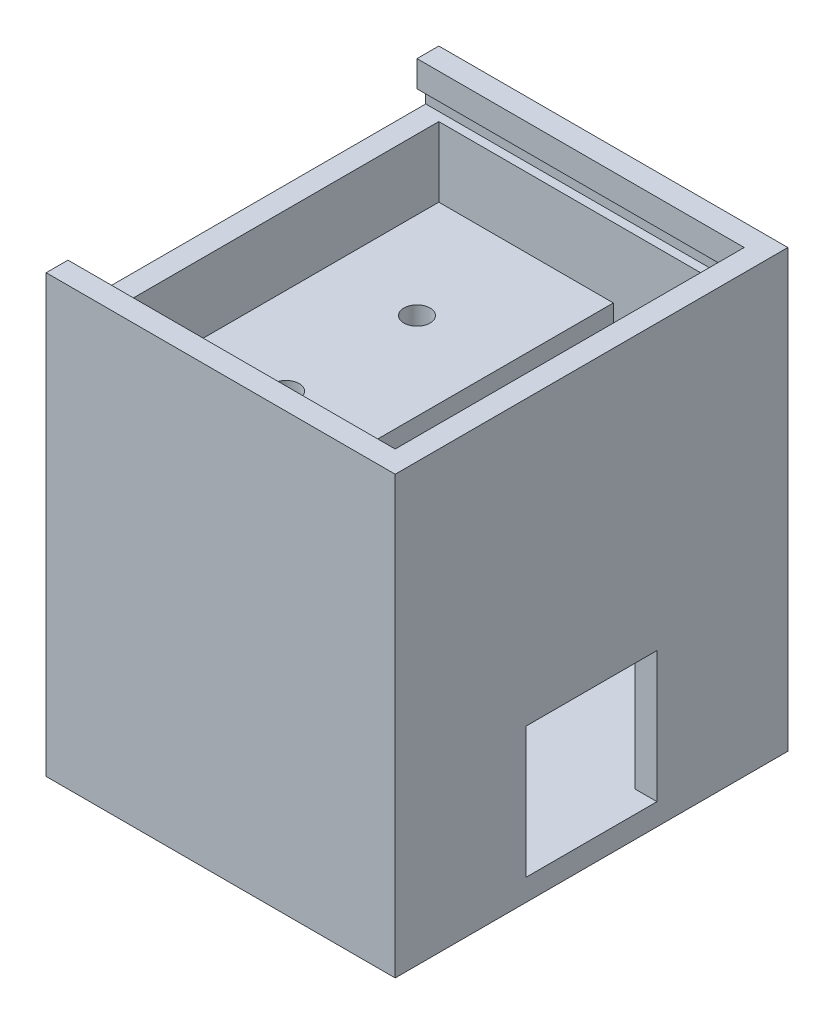
ISO-10303-21;
HEADER;
FILE_DESCRIPTION(('STEP AP214'),'2;1');
FILE_NAME('part.step','',(''),(''),'','','');
FILE_SCHEMA(('AUTOMOTIVE_DESIGN { 1 0 10303 214 1 1 1 1 }'));
ENDSEC;
DATA;
#1=APPLICATION_CONTEXT('core data for automotive mechanical design processes');
#2=APPLICATION_PROTOCOL_DEFINITION('international standard','automotive_design',2000,#1);
#3=PRODUCT_CONTEXT('',#1,'mechanical');
#4=PRODUCT('Part','Part','',(#3));
#5=PRODUCT_RELATED_PRODUCT_CATEGORY('part','',(#4));
#6=PRODUCT_DEFINITION_FORMATION('','',#4);
#7=PRODUCT_DEFINITION_CONTEXT('part definition',#1,'design');
#8=PRODUCT_DEFINITION('design','',#6,#7);
#9=PRODUCT_DEFINITION_SHAPE('','',#8);
#10=(LENGTH_UNIT() NAMED_UNIT(*) SI_UNIT(.MILLI.,.METRE.));
#11=(NAMED_UNIT(*) PLANE_ANGLE_UNIT() SI_UNIT($,.RADIAN.));
#12=(NAMED_UNIT(*) SI_UNIT($,.STERADIAN.) SOLID_ANGLE_UNIT());
#13=UNCERTAINTY_MEASURE_WITH_UNIT(LENGTH_MEASURE(1.E-05),#10,'distance_accuracy_value','');
#14=(GEOMETRIC_REPRESENTATION_CONTEXT(3) GLOBAL_UNCERTAINTY_ASSIGNED_CONTEXT((#13)) GLOBAL_UNIT_ASSIGNED_CONTEXT((#10,
#11,#12)) REPRESENTATION_CONTEXT('',''));
#15=CARTESIAN_POINT('',(0.,0.,0.));
#16=DIRECTION('',(0.,0.,1.));
#17=DIRECTION('',(1.,0.,0.));
#18=AXIS2_PLACEMENT_3D('',#15,#16,#17);
#19=CARTESIAN_POINT('',(-22.3887004628611,0.,15.9496536364091));
#20=DIRECTION('',(0.,1.,0.));
#21=DIRECTION('',(0.,0.,1.));
#22=AXIS2_PLACEMENT_3D('',#19,#20,#21);
#23=CYLINDRICAL_SURFACE('',#22,1.5);
#24=CARTESIAN_POINT('',(-22.3887004628611,37.,15.9496536364091));
#25=DIRECTION('',(0.,1.,0.));
#26=DIRECTION('',(0.,0.,1.));
#27=AXIS2_PLACEMENT_3D('',#24,#25,#26);
#28=CIRCLE('',#27,1.5);
#29=CARTESIAN_POINT('',(-22.3887004628611,37.,17.4496536364091));
#30=VERTEX_POINT('',#29);
#31=EDGE_CURVE('E234',#30,#30,#28,.T.);
#32=ORIENTED_EDGE('',*,*,#31,.T.);
#33=EDGE_LOOP('',(#32));
#34=FACE_BOUND('',#33,.T.);
#35=CARTESIAN_POINT('',(-22.3887004628611,5.,15.9496536364091));
#36=DIRECTION('',(0.,-1.,0.));
#37=DIRECTION('',(0.,0.,-1.));
#38=AXIS2_PLACEMENT_3D('',#35,#36,#37);
#39=CIRCLE('',#38,1.5);
#40=CARTESIAN_POINT('',(-22.3887004628611,5.,14.4496536364091));
#41=VERTEX_POINT('',#40);
#42=EDGE_CURVE('E37',#41,#41,#39,.F.);
#43=ORIENTED_EDGE('',*,*,#42,.F.);
#44=EDGE_LOOP('',(#43));
#45=FACE_BOUND('',#44,.T.);
#46=ADVANCED_FACE('F33',(#34,#45),#23,.F.);
#47=CARTESIAN_POINT('',(-22.3887004628611,0.,0.949653636409059));
#48=DIRECTION('',(0.,1.,0.));
#49=DIRECTION('',(0.,0.,1.));
#50=AXIS2_PLACEMENT_3D('',#47,#48,#49);
#51=CYLINDRICAL_SURFACE('',#50,1.5);
#52=CARTESIAN_POINT('',(-22.3887004628611,37.,0.949653636409066));
#53=DIRECTION('',(0.,1.,0.));
#54=DIRECTION('',(0.,0.,1.));
#55=AXIS2_PLACEMENT_3D('',#52,#53,#54);
#56=CIRCLE('',#55,1.5);
#57=CARTESIAN_POINT('',(-22.3887004628611,37.,2.44965363640907));
#58=VERTEX_POINT('',#57);
#59=EDGE_CURVE('E231',#58,#58,#56,.T.);
#60=ORIENTED_EDGE('',*,*,#59,.T.);
#61=EDGE_LOOP('',(#60));
#62=FACE_BOUND('',#61,.T.);
#63=CARTESIAN_POINT('',(-22.3887004628611,5.,0.94965363640906));
#64=DIRECTION('',(0.,-1.,0.));
#65=DIRECTION('',(0.,0.,-1.));
#66=AXIS2_PLACEMENT_3D('',#63,#64,#65);
#67=CIRCLE('',#66,1.5);
#68=CARTESIAN_POINT('',(-22.3887004628611,5.,-0.550346363590941));
#69=VERTEX_POINT('',#68);
#70=EDGE_CURVE('E222',#69,#69,#67,.F.);
#71=ORIENTED_EDGE('',*,*,#70,.F.);
#72=EDGE_LOOP('',(#71));
#73=FACE_BOUND('',#72,.T.);
#74=ADVANCED_FACE('F379',(#62,#73),#51,.F.);
#75=CARTESIAN_POINT('',(-34.8887004628611,50.,28.4496536364091));
#76=DIRECTION('',(0.,0.,-1.));
#77=DIRECTION('',(-1.,0.,0.));
#78=AXIS2_PLACEMENT_3D('',#75,#76,#77);
#79=PLANE('',#78);
#80=DIRECTION('',(-1.,0.,0.));
#81=VECTOR('',#80,1.);
#82=CARTESIAN_POINT('',(-34.8887004628611,45.,28.4496536364091));
#83=LINE('',#82,#81);
#84=CARTESIAN_POINT('',(2.61129953713887,45.,28.4496536364091));
#85=VERTEX_POINT('',#84);
#86=CARTESIAN_POINT('',(-32.3887004628611,45.,28.4496536364091));
#87=VERTEX_POINT('',#86);
#88=EDGE_CURVE('E242',#85,#87,#83,.T.);
#89=ORIENTED_EDGE('',*,*,#88,.F.);
#90=DIRECTION('',(0.,-1.,0.));
#91=VECTOR('',#90,1.);
#92=CARTESIAN_POINT('',(2.61129953713887,50.,28.4496536364091));
#93=LINE('',#92,#91);
#94=CARTESIAN_POINT('',(2.61129953713887,2.5,28.4496536364091));
#95=VERTEX_POINT('',#94);
#96=EDGE_CURVE('E329',#85,#95,#93,.T.);
#97=ORIENTED_EDGE('',*,*,#96,.T.);
#98=DIRECTION('',(1.,0.,0.));
#99=VECTOR('',#98,1.);
#100=CARTESIAN_POINT('',(-34.8887004628611,2.5,28.4496536364091));
#101=LINE('',#100,#99);
#102=CARTESIAN_POINT('',(-12.3887004628611,2.5,28.4496536364091));
#103=VERTEX_POINT('',#102);
#104=EDGE_CURVE('E315',#103,#95,#101,.T.);
#105=ORIENTED_EDGE('',*,*,#104,.F.);
#106=DIRECTION('',(0.,-1.,0.));
#107=VECTOR('',#106,1.);
#108=CARTESIAN_POINT('',(-12.3887004628611,2.49999999999999,28.4496536364091));
#109=LINE('',#108,#107);
#110=CARTESIAN_POINT('',(-12.3887004628611,37.,28.4496536364091));
#111=VERTEX_POINT('',#110);
#112=EDGE_CURVE('E301',#111,#103,#109,.T.);
#113=ORIENTED_EDGE('',*,*,#112,.F.);
#114=DIRECTION('',(-1.,0.,0.));
#115=VECTOR('',#114,1.);
#116=CARTESIAN_POINT('',(-12.3887004628611,37.,28.4496536364091));
#117=LINE('',#116,#115);
#118=CARTESIAN_POINT('',(-32.3887004628611,37.,28.4496536364091));
#119=VERTEX_POINT('',#118);
#120=EDGE_CURVE('E307',#111,#119,#117,.T.);
#121=ORIENTED_EDGE('',*,*,#120,.T.);
#122=DIRECTION('',(0.,-1.,0.));
#123=VECTOR('',#122,1.);
#124=CARTESIAN_POINT('',(-32.3887004628611,50.,28.4496536364091));
#125=LINE('',#124,#123);
#126=EDGE_CURVE('E316',#87,#119,#125,.T.);
#127=ORIENTED_EDGE('',*,*,#126,.F.);
#128=EDGE_LOOP('',(#89,#97,#105,#113,#121,#127));
#129=FACE_BOUND('',#128,.T.);
#130=ADVANCED_FACE('F385',(#129),#79,.T.);
#131=CARTESIAN_POINT('',(-34.8887004628611,50.,-11.5503463635909));
#132=DIRECTION('',(0.,0.,1.));
#133=DIRECTION('',(1.,0.,0.));
#134=AXIS2_PLACEMENT_3D('',#131,#132,#133);
#135=PLANE('',#134);
#136=DIRECTION('',(-1.,0.,0.));
#137=VECTOR('',#136,1.);
#138=CARTESIAN_POINT('',(-34.8887004628611,47.,-11.5503463635909));
#139=LINE('',#138,#137);
#140=CARTESIAN_POINT('',(2.61129953713886,47.,-11.5503463635909));
#141=VERTEX_POINT('',#140);
#142=CARTESIAN_POINT('',(-34.8887004628611,47.,-11.5503463635909));
#143=VERTEX_POINT('',#142);
#144=EDGE_CURVE('E265',#141,#143,#139,.T.);
#145=ORIENTED_EDGE('',*,*,#144,.F.);
#146=DIRECTION('',(0.,-1.,0.));
#147=VECTOR('',#146,1.);
#148=CARTESIAN_POINT('',(2.61129953713887,50.,-11.5503463635909));
#149=LINE('',#148,#147);
#150=CARTESIAN_POINT('',(2.61129953713886,50.,-11.5503463635909));
#151=VERTEX_POINT('',#150);
#152=EDGE_CURVE('E334',#151,#141,#149,.T.);
#153=ORIENTED_EDGE('',*,*,#152,.F.);
#154=DIRECTION('',(-1.,0.,0.));
#155=VECTOR('',#154,1.);
#156=CARTESIAN_POINT('',(-34.8887004628611,50.,-11.5503463635909));
#157=LINE('',#156,#155);
#158=CARTESIAN_POINT('',(-34.8887004628611,50.,-11.5503463635909));
#159=VERTEX_POINT('',#158);
#160=EDGE_CURVE('E323',#151,#159,#157,.T.);
#161=ORIENTED_EDGE('',*,*,#160,.T.);
#162=DIRECTION('',(0.,1.,0.));
#163=VECTOR('',#162,1.);
#164=CARTESIAN_POINT('',(-34.8887004628611,50.,-11.5503463635909));
#165=LINE('',#164,#163);
#166=EDGE_CURVE('E285',#143,#159,#165,.T.);
#167=ORIENTED_EDGE('',*,*,#166,.F.);
#168=EDGE_LOOP('',(#145,#153,#161,#167));
#169=FACE_BOUND('',#168,.T.);
#170=ADVANCED_FACE('F424',(#169),#135,.T.);
#171=CARTESIAN_POINT('',(-32.3887004628611,50.,-14.0503463635909));
#172=DIRECTION('',(1.,0.,0.));
#173=DIRECTION('',(0.,0.,-1.));
#174=AXIS2_PLACEMENT_3D('',#171,#172,#173);
#175=PLANE('',#174);
#176=DIRECTION('',(0.,0.,-1.));
#177=VECTOR('',#176,1.);
#178=CARTESIAN_POINT('',(-32.3887004628611,45.,-11.5503463635909));
#179=LINE('',#178,#177);
#180=CARTESIAN_POINT('',(-32.3887004628611,45.,-11.5503463635909));
#181=VERTEX_POINT('',#180);
#182=EDGE_CURVE('E280',#87,#181,#179,.T.);
#183=ORIENTED_EDGE('',*,*,#182,.F.);
#184=ORIENTED_EDGE('',*,*,#126,.T.);
#185=DIRECTION('',(0.,0.,1.));
#186=VECTOR('',#185,1.);
#187=CARTESIAN_POINT('',(-32.3887004628611,37.,-11.5503463635909));
#188=LINE('',#187,#186);
#189=CARTESIAN_POINT('',(-32.3887004628611,37.,-11.5503463635909));
#190=VERTEX_POINT('',#189);
#191=EDGE_CURVE('E292',#190,#119,#188,.T.);
#192=ORIENTED_EDGE('',*,*,#191,.F.);
#193=DIRECTION('',(0.,-1.,0.));
#194=VECTOR('',#193,1.);
#195=CARTESIAN_POINT('',(-32.3887004628611,50.,-11.5503463635909));
#196=LINE('',#195,#194);
#197=EDGE_CURVE('E320',#181,#190,#196,.T.);
#198=ORIENTED_EDGE('',*,*,#197,.F.);
#199=EDGE_LOOP('',(#183,#184,#192,#198));
#200=FACE_BOUND('',#199,.T.);
#201=ADVANCED_FACE('F420',(#200),#175,.T.);
#202=DIRECTION('',(1.,0.,0.));
#203=VECTOR('',#202,1.);
#204=CARTESIAN_POINT('',(-34.8887004628611,47.,28.4496536364091));
#205=LINE('',#204,#203);
#206=CARTESIAN_POINT('',(-34.8887004628611,47.,28.4496536364091));
#207=VERTEX_POINT('',#206);
#208=CARTESIAN_POINT('',(2.61129953713887,47.,28.4496536364091));
#209=VERTEX_POINT('',#208);
#210=EDGE_CURVE('E237',#207,#209,#205,.T.);
#211=ORIENTED_EDGE('',*,*,#210,.F.);
#212=DIRECTION('',(0.,-1.,0.));
#213=VECTOR('',#212,1.);
#214=CARTESIAN_POINT('',(-34.8887004628611,50.,28.4496536364091));
#215=LINE('',#214,#213);
#216=CARTESIAN_POINT('',(-34.8887004628611,50.,28.4496536364091));
#217=VERTEX_POINT('',#216);
#218=EDGE_CURVE('E287',#217,#207,#215,.T.);
#219=ORIENTED_EDGE('',*,*,#218,.F.);
#220=DIRECTION('',(1.,0.,0.));
#221=VECTOR('',#220,1.);
#222=CARTESIAN_POINT('',(-34.8887004628611,50.,28.4496536364091));
#223=LINE('',#222,#221);
#224=CARTESIAN_POINT('',(2.61129953713887,50.,28.4496536364091));
#225=VERTEX_POINT('',#224);
#226=EDGE_CURVE('E338',#217,#225,#223,.T.);
#227=ORIENTED_EDGE('',*,*,#226,.T.);
#228=EDGE_CURVE('E319',#225,#209,#93,.T.);
#229=ORIENTED_EDGE('',*,*,#228,.T.);
#230=EDGE_LOOP('',(#211,#219,#227,#229));
#231=FACE_BOUND('',#230,.T.);
#232=ADVANCED_FACE('F423',(#231),#79,.T.);
#233=DIRECTION('',(1.,0.,0.));
#234=VECTOR('',#233,1.);
#235=CARTESIAN_POINT('',(-34.8887004628611,45.,-11.5503463635909));
#236=LINE('',#235,#234);
#237=CARTESIAN_POINT('',(2.61129953713887,45.,-11.5503463635909));
#238=VERTEX_POINT('',#237);
#239=EDGE_CURVE('E257',#181,#238,#236,.T.);
#240=ORIENTED_EDGE('',*,*,#239,.F.);
#241=ORIENTED_EDGE('',*,*,#197,.T.);
#242=DIRECTION('',(-1.,0.,0.));
#243=VECTOR('',#242,1.);
#244=CARTESIAN_POINT('',(-12.3887004628611,37.,-11.5503463635909));
#245=LINE('',#244,#243);
#246=CARTESIAN_POINT('',(-12.3887004628611,37.,-11.5503463635909));
#247=VERTEX_POINT('',#246);
#248=EDGE_CURVE('E312',#247,#190,#245,.T.);
#249=ORIENTED_EDGE('',*,*,#248,.F.);
#250=DIRECTION('',(0.,1.,0.));
#251=VECTOR('',#250,1.);
#252=CARTESIAN_POINT('',(-12.3887004628611,2.5,-11.5503463635909));
#253=LINE('',#252,#251);
#254=CARTESIAN_POINT('',(-12.3887004628611,2.5,-11.5503463635909));
#255=VERTEX_POINT('',#254);
#256=EDGE_CURVE('E295',#255,#247,#253,.T.);
#257=ORIENTED_EDGE('',*,*,#256,.F.);
#258=DIRECTION('',(-1.,0.,0.));
#259=VECTOR('',#258,1.);
#260=CARTESIAN_POINT('',(-34.8887004628611,2.5,-11.5503463635909));
#261=LINE('',#260,#259);
#262=CARTESIAN_POINT('',(2.61129953713886,2.5,-11.5503463635909));
#263=VERTEX_POINT('',#262);
#264=EDGE_CURVE('E333',#263,#255,#261,.T.);
#265=ORIENTED_EDGE('',*,*,#264,.F.);
#266=EDGE_CURVE('E322',#238,#263,#149,.T.);
#267=ORIENTED_EDGE('',*,*,#266,.F.);
#268=EDGE_LOOP('',(#240,#241,#249,#257,#265,#267));
#269=FACE_BOUND('',#268,.T.);
#270=ADVANCED_FACE('F428',(#269),#135,.T.);
#271=CARTESIAN_POINT('',(-34.8887004628611,50.,-14.0503463635909));
#272=DIRECTION('',(1.,0.,0.));
#273=DIRECTION('',(0.,0.,-1.));
#274=AXIS2_PLACEMENT_3D('',#271,#272,#273);
#275=PLANE('',#274);
#276=DIRECTION('',(0.,1.,0.));
#277=VECTOR('',#276,1.);
#278=CARTESIAN_POINT('',(-34.8887004628611,45.,29.4496536364091));
#279=LINE('',#278,#277);
#280=CARTESIAN_POINT('',(-34.8887004628611,45.,29.4496536364091));
#281=VERTEX_POINT('',#280);
#282=CARTESIAN_POINT('',(-34.8887004628611,47.,29.4496536364091));
#283=VERTEX_POINT('',#282);
#284=EDGE_CURVE('E238',#281,#283,#279,.T.);
#285=ORIENTED_EDGE('',*,*,#284,.F.);
#286=DIRECTION('',(0.,0.,-1.));
#287=VECTOR('',#286,1.);
#288=CARTESIAN_POINT('',(-34.8887004628611,45.,-11.5503463635909));
#289=LINE('',#288,#287);
#290=CARTESIAN_POINT('',(-34.8887004628611,45.,-12.5503463635909));
#291=VERTEX_POINT('',#290);
#292=EDGE_CURVE('E290',#281,#291,#289,.T.);
#293=ORIENTED_EDGE('',*,*,#292,.T.);
#294=DIRECTION('',(0.,-1.,0.));
#295=VECTOR('',#294,1.);
#296=CARTESIAN_POINT('',(-34.8887004628611,45.,-12.5503463635909));
#297=LINE('',#296,#295);
#298=CARTESIAN_POINT('',(-34.8887004628611,47.,-12.5503463635909));
#299=VERTEX_POINT('',#298);
#300=EDGE_CURVE('E261',#299,#291,#297,.T.);
#301=ORIENTED_EDGE('',*,*,#300,.F.);
#302=DIRECTION('',(0.,0.,1.));
#303=VECTOR('',#302,1.);
#304=CARTESIAN_POINT('',(-34.8887004628611,47.,-12.5503463635909));
#305=LINE('',#304,#303);
#306=EDGE_CURVE('E277',#299,#143,#305,.T.);
#307=ORIENTED_EDGE('',*,*,#306,.T.);
#308=ORIENTED_EDGE('',*,*,#166,.T.);
#309=DIRECTION('',(0.,0.,1.));
#310=VECTOR('',#309,1.);
#311=CARTESIAN_POINT('',(-34.8887004628611,50.,-14.0503463635909));
#312=LINE('',#311,#310);
#313=CARTESIAN_POINT('',(-34.8887004628611,50.,-14.0503463635909));
#314=VERTEX_POINT('',#313);
#315=EDGE_CURVE('E345',#314,#159,#312,.T.);
#316=ORIENTED_EDGE('',*,*,#315,.F.);
#317=DIRECTION('',(0.,-1.,0.));
#318=VECTOR('',#317,1.);
#319=CARTESIAN_POINT('',(-34.8887004628611,50.,-14.0503463635909));
#320=LINE('',#319,#318);
#321=CARTESIAN_POINT('',(-34.8887004628611,0.,-14.0503463635909));
#322=VERTEX_POINT('',#321);
#323=EDGE_CURVE('E355',#314,#322,#320,.T.);
#324=ORIENTED_EDGE('',*,*,#323,.T.);
#325=DIRECTION('',(0.,0.,1.));
#326=VECTOR('',#325,1.);
#327=CARTESIAN_POINT('',(-34.8887004628611,0.,-14.0503463635909));
#328=LINE('',#327,#326);
#329=CARTESIAN_POINT('',(-34.8887004628611,0.,30.9496536364091));
#330=VERTEX_POINT('',#329);
#331=EDGE_CURVE('E318',#322,#330,#328,.T.);
#332=ORIENTED_EDGE('',*,*,#331,.T.);
#333=DIRECTION('',(0.,-1.,0.));
#334=VECTOR('',#333,1.);
#335=CARTESIAN_POINT('',(-34.8887004628611,50.,30.9496536364091));
#336=LINE('',#335,#334);
#337=CARTESIAN_POINT('',(-34.8887004628611,50.,30.9496536364091));
#338=VERTEX_POINT('',#337);
#339=EDGE_CURVE('E11',#338,#330,#336,.T.);
#340=ORIENTED_EDGE('',*,*,#339,.F.);
#341=EDGE_CURVE('E349',#217,#338,#312,.T.);
#342=ORIENTED_EDGE('',*,*,#341,.F.);
#343=ORIENTED_EDGE('',*,*,#218,.T.);
#344=DIRECTION('',(0.,0.,-1.));
#345=VECTOR('',#344,1.);
#346=CARTESIAN_POINT('',(-34.8887004628611,47.,29.4496536364091));
#347=LINE('',#346,#345);
#348=EDGE_CURVE('E251',#283,#207,#347,.T.);
#349=ORIENTED_EDGE('',*,*,#348,.F.);
#350=EDGE_LOOP('',(#285,#293,#301,#307,#308,#316,#324,#332,#340,#342,#343,#349));
#351=FACE_BOUND('',#350,.T.);
#352=ADVANCED_FACE('F35',(#351),#275,.F.);
#353=CARTESIAN_POINT('',(-34.8887004628611,50.,30.9496536364091));
#354=DIRECTION('',(0.,0.,-1.));
#355=DIRECTION('',(-1.,0.,0.));
#356=AXIS2_PLACEMENT_3D('',#353,#354,#355);
#357=PLANE('',#356);
#358=DIRECTION('',(1.,0.,0.));
#359=VECTOR('',#358,1.);
#360=CARTESIAN_POINT('',(-34.8887004628611,0.,30.9496536364091));
#361=LINE('',#360,#359);
#362=CARTESIAN_POINT('',(5.11129953713887,0.,30.9496536364091));
#363=VERTEX_POINT('',#362);
#364=EDGE_CURVE('E358',#330,#363,#361,.T.);
#365=ORIENTED_EDGE('',*,*,#364,.T.);
#366=DIRECTION('',(0.,-1.,0.));
#367=VECTOR('',#366,1.);
#368=CARTESIAN_POINT('',(5.11129953713887,50.,30.9496536364091));
#369=LINE('',#368,#367);
#370=CARTESIAN_POINT('',(5.11129953713887,50.,30.9496536364091));
#371=VERTEX_POINT('',#370);
#372=EDGE_CURVE('E42',#371,#363,#369,.T.);
#373=ORIENTED_EDGE('',*,*,#372,.F.);
#374=DIRECTION('',(1.,0.,0.));
#375=VECTOR('',#374,1.);
#376=CARTESIAN_POINT('',(-34.8887004628611,50.,30.9496536364091));
#377=LINE('',#376,#375);
#378=EDGE_CURVE('E348',#338,#371,#377,.T.);
#379=ORIENTED_EDGE('',*,*,#378,.F.);
#380=ORIENTED_EDGE('',*,*,#339,.T.);
#381=EDGE_LOOP('',(#365,#373,#379,#380));
#382=FACE_BOUND('',#381,.T.);
#383=ADVANCED_FACE('F453',(#382),#357,.F.);
#384=CARTESIAN_POINT('',(5.11129953713886,50.,-14.0503463635909));
#385=DIRECTION('',(-1.,0.,0.));
#386=DIRECTION('',(0.,0.,1.));
#387=AXIS2_PLACEMENT_3D('',#384,#385,#386);
#388=PLANE('',#387);
#389=DIRECTION('',(0.,0.,1.));
#390=VECTOR('',#389,1.);
#391=CARTESIAN_POINT('',(5.11129953713887,2.5,15.9496536364091));
#392=LINE('',#391,#390);
#393=CARTESIAN_POINT('',(5.11129953713886,2.5,0.949653636409072));
#394=VERTEX_POINT('',#393);
#395=CARTESIAN_POINT('',(5.11129953713887,2.5,15.9496536364091));
#396=VERTEX_POINT('',#395);
#397=EDGE_CURVE('E195',#394,#396,#392,.T.);
#398=ORIENTED_EDGE('',*,*,#397,.T.);
#399=DIRECTION('',(0.,1.,0.));
#400=VECTOR('',#399,1.);
#401=CARTESIAN_POINT('',(5.11129953713887,2.5,15.9496536364091));
#402=LINE('',#401,#400);
#403=CARTESIAN_POINT('',(5.11129953713887,17.5,15.9496536364091));
#404=VERTEX_POINT('',#403);
#405=EDGE_CURVE('E187',#396,#404,#402,.T.);
#406=ORIENTED_EDGE('',*,*,#405,.T.);
#407=DIRECTION('',(0.,0.,-1.));
#408=VECTOR('',#407,1.);
#409=CARTESIAN_POINT('',(5.11129953713887,17.5,15.9496536364091));
#410=LINE('',#409,#408);
#411=CARTESIAN_POINT('',(5.11129953713886,17.5,0.949653636409071));
#412=VERTEX_POINT('',#411);
#413=EDGE_CURVE('E198',#404,#412,#410,.T.);
#414=ORIENTED_EDGE('',*,*,#413,.T.);
#415=DIRECTION('',(0.,-1.,0.));
#416=VECTOR('',#415,1.);
#417=CARTESIAN_POINT('',(5.11129953713886,2.5,0.949653636409072));
#418=LINE('',#417,#416);
#419=EDGE_CURVE('E50',#412,#394,#418,.T.);
#420=ORIENTED_EDGE('',*,*,#419,.T.);
#421=EDGE_LOOP('',(#398,#406,#414,#420));
#422=FACE_BOUND('',#421,.T.);
#423=DIRECTION('',(0.,0.,-1.));
#424=VECTOR('',#423,1.);
#425=CARTESIAN_POINT('',(5.11129953713886,0.,-14.0503463635909));
#426=LINE('',#425,#424);
#427=CARTESIAN_POINT('',(5.11129953713886,0.,-14.0503463635909));
#428=VERTEX_POINT('',#427);
#429=EDGE_CURVE('E360',#363,#428,#426,.T.);
#430=ORIENTED_EDGE('',*,*,#429,.T.);
#431=DIRECTION('',(0.,-1.,0.));
#432=VECTOR('',#431,1.);
#433=CARTESIAN_POINT('',(5.11129953713886,50.,-14.0503463635909));
#434=LINE('',#433,#432);
#435=CARTESIAN_POINT('',(5.11129953713886,50.,-14.0503463635909));
#436=VERTEX_POINT('',#435);
#437=EDGE_CURVE('E366',#436,#428,#434,.T.);
#438=ORIENTED_EDGE('',*,*,#437,.F.);
#439=DIRECTION('',(0.,0.,-1.));
#440=VECTOR('',#439,1.);
#441=CARTESIAN_POINT('',(5.11129953713886,50.,-14.0503463635909));
#442=LINE('',#441,#440);
#443=EDGE_CURVE('E351',#371,#436,#442,.T.);
#444=ORIENTED_EDGE('',*,*,#443,.F.);
#445=ORIENTED_EDGE('',*,*,#372,.T.);
#446=EDGE_LOOP('',(#430,#438,#444,#445));
#447=FACE_BOUND('',#446,.T.);
#448=ADVANCED_FACE('F202',(#422,#447),#388,.F.);
#449=CARTESIAN_POINT('',(-34.8887004628611,50.,-14.0503463635909));
#450=DIRECTION('',(0.,0.,1.));
#451=DIRECTION('',(1.,0.,0.));
#452=AXIS2_PLACEMENT_3D('',#449,#450,#451);
#453=PLANE('',#452);
#454=DIRECTION('',(-1.,0.,0.));
#455=VECTOR('',#454,1.);
#456=CARTESIAN_POINT('',(-34.8887004628611,0.,-14.0503463635909));
#457=LINE('',#456,#455);
#458=EDGE_CURVE('E362',#428,#322,#457,.T.);
#459=ORIENTED_EDGE('',*,*,#458,.T.);
#460=ORIENTED_EDGE('',*,*,#323,.F.);
#461=DIRECTION('',(-1.,0.,0.));
#462=VECTOR('',#461,1.);
#463=CARTESIAN_POINT('',(-34.8887004628611,50.,-14.0503463635909));
#464=LINE('',#463,#462);
#465=EDGE_CURVE('E353',#436,#314,#464,.T.);
#466=ORIENTED_EDGE('',*,*,#465,.F.);
#467=ORIENTED_EDGE('',*,*,#437,.T.);
#468=EDGE_LOOP('',(#459,#460,#466,#467));
#469=FACE_BOUND('',#468,.T.);
#470=ADVANCED_FACE('F444',(#469),#453,.F.);
#471=CARTESIAN_POINT('',(0.,50.,0.));
#472=DIRECTION('',(0.,1.,0.));
#473=DIRECTION('',(0.,0.,1.));
#474=AXIS2_PLACEMENT_3D('',#471,#472,#473);
#475=PLANE('',#474);
#476=ORIENTED_EDGE('',*,*,#315,.T.);
#477=ORIENTED_EDGE('',*,*,#160,.F.);
#478=DIRECTION('',(0.,0.,-1.));
#479=VECTOR('',#478,1.);
#480=CARTESIAN_POINT('',(2.61129953713886,50.,-14.0503463635909));
#481=LINE('',#480,#479);
#482=EDGE_CURVE('E340',#225,#151,#481,.T.);
#483=ORIENTED_EDGE('',*,*,#482,.F.);
#484=ORIENTED_EDGE('',*,*,#226,.F.);
#485=ORIENTED_EDGE('',*,*,#341,.T.);
#486=ORIENTED_EDGE('',*,*,#378,.T.);
#487=ORIENTED_EDGE('',*,*,#443,.T.);
#488=ORIENTED_EDGE('',*,*,#465,.T.);
#489=EDGE_LOOP('',(#476,#477,#483,#484,#485,#486,#487,#488));
#490=FACE_BOUND('',#489,.T.);
#491=ADVANCED_FACE('F441',(#490),#475,.T.);
#492=CARTESIAN_POINT('',(0.,0.,0.));
#493=DIRECTION('',(0.,1.,0.));
#494=DIRECTION('',(0.,0.,1.));
#495=AXIS2_PLACEMENT_3D('',#492,#493,#494);
#496=PLANE('',#495);
#497=CARTESIAN_POINT('',(-22.3887004628611,0.,15.9496536364091));
#498=DIRECTION('',(0.,-1.,0.));
#499=DIRECTION('',(0.,0.,-1.));
#500=AXIS2_PLACEMENT_3D('',#497,#498,#499);
#501=CIRCLE('',#500,3.);
#502=CARTESIAN_POINT('',(-22.3887004628611,0.,12.9496536364091));
#503=VERTEX_POINT('',#502);
#504=EDGE_CURVE('E223',#503,#503,#501,.T.);
#505=ORIENTED_EDGE('',*,*,#504,.F.);
#506=EDGE_LOOP('',(#505));
#507=FACE_BOUND('',#506,.T.);
#508=CARTESIAN_POINT('',(-22.3887004628611,0.,0.949653636409059));
#509=DIRECTION('',(0.,-1.,0.));
#510=DIRECTION('',(0.,0.,-1.));
#511=AXIS2_PLACEMENT_3D('',#508,#509,#510);
#512=CIRCLE('',#511,3.);
#513=CARTESIAN_POINT('',(-22.3887004628611,0.,-2.05034636359094));
#514=VERTEX_POINT('',#513);
#515=EDGE_CURVE('E215',#514,#514,#512,.T.);
#516=ORIENTED_EDGE('',*,*,#515,.F.);
#517=EDGE_LOOP('',(#516));
#518=FACE_BOUND('',#517,.T.);
#519=ORIENTED_EDGE('',*,*,#331,.F.);
#520=ORIENTED_EDGE('',*,*,#458,.F.);
#521=ORIENTED_EDGE('',*,*,#429,.F.);
#522=ORIENTED_EDGE('',*,*,#364,.F.);
#523=EDGE_LOOP('',(#519,#520,#521,#522));
#524=FACE_BOUND('',#523,.T.);
#525=ADVANCED_FACE('F433',(#507,#518,#524),#496,.F.);
#526=CARTESIAN_POINT('',(2.61129953713886,50.,-14.0503463635909));
#527=DIRECTION('',(-1.,0.,0.));
#528=DIRECTION('',(0.,0.,1.));
#529=AXIS2_PLACEMENT_3D('',#526,#527,#528);
#530=PLANE('',#529);
#531=DIRECTION('',(0.,1.,0.));
#532=VECTOR('',#531,1.);
#533=CARTESIAN_POINT('',(2.61129953713887,2.5,15.9496536364091));
#534=LINE('',#533,#532);
#535=CARTESIAN_POINT('',(2.61129953713887,2.5,15.9496536364091));
#536=VERTEX_POINT('',#535);
#537=CARTESIAN_POINT('',(2.61129953713887,17.5,15.9496536364091));
#538=VERTEX_POINT('',#537);
#539=EDGE_CURVE('E190',#536,#538,#534,.T.);
#540=ORIENTED_EDGE('',*,*,#539,.F.);
#541=DIRECTION('',(0.,0.,-1.));
#542=VECTOR('',#541,1.);
#543=CARTESIAN_POINT('',(2.61129953713886,2.5,-14.0503463635909));
#544=LINE('',#543,#542);
#545=EDGE_CURVE('E330',#95,#536,#544,.T.);
#546=ORIENTED_EDGE('',*,*,#545,.F.);
#547=ORIENTED_EDGE('',*,*,#96,.F.);
#548=DIRECTION('',(0.,0.,-1.));
#549=VECTOR('',#548,1.);
#550=CARTESIAN_POINT('',(2.61129953713887,45.,29.4496536364091));
#551=LINE('',#550,#549);
#552=CARTESIAN_POINT('',(2.61129953713887,45.,29.4496536364091));
#553=VERTEX_POINT('',#552);
#554=EDGE_CURVE('E255',#553,#85,#551,.T.);
#555=ORIENTED_EDGE('',*,*,#554,.F.);
#556=DIRECTION('',(0.,-1.,0.));
#557=VECTOR('',#556,1.);
#558=CARTESIAN_POINT('',(2.61129953713887,45.,29.4496536364091));
#559=LINE('',#558,#557);
#560=CARTESIAN_POINT('',(2.61129953713887,47.,29.4496536364091));
#561=VERTEX_POINT('',#560);
#562=EDGE_CURVE('E245',#561,#553,#559,.T.);
#563=ORIENTED_EDGE('',*,*,#562,.F.);
#564=DIRECTION('',(0.,0.,-1.));
#565=VECTOR('',#564,1.);
#566=CARTESIAN_POINT('',(2.61129953713887,47.,29.4496536364091));
#567=LINE('',#566,#565);
#568=EDGE_CURVE('E258',#561,#209,#567,.T.);
#569=ORIENTED_EDGE('',*,*,#568,.T.);
#570=ORIENTED_EDGE('',*,*,#228,.F.);
#571=ORIENTED_EDGE('',*,*,#482,.T.);
#572=ORIENTED_EDGE('',*,*,#152,.T.);
#573=DIRECTION('',(0.,0.,1.));
#574=VECTOR('',#573,1.);
#575=CARTESIAN_POINT('',(2.61129953713886,47.,-12.5503463635909));
#576=LINE('',#575,#574);
#577=CARTESIAN_POINT('',(2.61129953713886,47.,-12.5503463635909));
#578=VERTEX_POINT('',#577);
#579=EDGE_CURVE('E281',#578,#141,#576,.T.);
#580=ORIENTED_EDGE('',*,*,#579,.F.);
#581=DIRECTION('',(0.,1.,0.));
#582=VECTOR('',#581,1.);
#583=CARTESIAN_POINT('',(2.61129953713887,45.,-12.5503463635909));
#584=LINE('',#583,#582);
#585=CARTESIAN_POINT('',(2.61129953713887,45.,-12.5503463635909));
#586=VERTEX_POINT('',#585);
#587=EDGE_CURVE('E268',#586,#578,#584,.T.);
#588=ORIENTED_EDGE('',*,*,#587,.F.);
#589=DIRECTION('',(0.,0.,1.));
#590=VECTOR('',#589,1.);
#591=CARTESIAN_POINT('',(2.61129953713887,45.,-12.5503463635909));
#592=LINE('',#591,#590);
#593=EDGE_CURVE('E274',#586,#238,#592,.T.);
#594=ORIENTED_EDGE('',*,*,#593,.T.);
#595=ORIENTED_EDGE('',*,*,#266,.T.);
#596=CARTESIAN_POINT('',(2.61129953713886,2.5,0.949653636409073));
#597=VERTEX_POINT('',#596);
#598=EDGE_CURVE('E326',#597,#263,#544,.T.);
#599=ORIENTED_EDGE('',*,*,#598,.F.);
#600=DIRECTION('',(0.,-1.,0.));
#601=VECTOR('',#600,1.);
#602=CARTESIAN_POINT('',(2.61129953713886,2.5,0.949653636409073));
#603=LINE('',#602,#601);
#604=CARTESIAN_POINT('',(2.61129953713886,17.5,0.949653636409073));
#605=VERTEX_POINT('',#604);
#606=EDGE_CURVE('E55',#605,#597,#603,.T.);
#607=ORIENTED_EDGE('',*,*,#606,.F.);
#608=DIRECTION('',(0.,0.,-1.));
#609=VECTOR('',#608,1.);
#610=CARTESIAN_POINT('',(2.61129953713887,17.5,15.9496536364091));
#611=LINE('',#610,#609);
#612=EDGE_CURVE('E206',#538,#605,#611,.T.);
#613=ORIENTED_EDGE('',*,*,#612,.F.);
#614=EDGE_LOOP('',(#540,#546,#547,#555,#563,#569,#570,#571,#572,#580,#588,#594,#595,#599,#607,#613));
#615=FACE_BOUND('',#614,.T.);
#616=ADVANCED_FACE('F430',(#615),#530,.T.);
#617=CARTESIAN_POINT('',(0.,2.5,0.));
#618=DIRECTION('',(0.,1.,0.));
#619=DIRECTION('',(0.,0.,1.));
#620=AXIS2_PLACEMENT_3D('',#617,#618,#619);
#621=PLANE('',#620);
#622=DIRECTION('',(0.,0.,-1.));
#623=VECTOR('',#622,1.);
#624=CARTESIAN_POINT('',(-12.3887004628611,2.5,-11.5503463635909));
#625=LINE('',#624,#623);
#626=EDGE_CURVE('E304',#103,#255,#625,.T.);
#627=ORIENTED_EDGE('',*,*,#626,.F.);
#628=ORIENTED_EDGE('',*,*,#104,.T.);
#629=ORIENTED_EDGE('',*,*,#545,.T.);
#630=DIRECTION('',(-1.,0.,0.));
#631=VECTOR('',#630,1.);
#632=CARTESIAN_POINT('',(5.11129953713887,2.5,15.9496536364091));
#633=LINE('',#632,#631);
#634=EDGE_CURVE('E213',#396,#536,#633,.T.);
#635=ORIENTED_EDGE('',*,*,#634,.F.);
#636=ORIENTED_EDGE('',*,*,#397,.F.);
#637=DIRECTION('',(-1.,0.,0.));
#638=VECTOR('',#637,1.);
#639=CARTESIAN_POINT('',(5.11129953713886,2.5,0.949653636409072));
#640=LINE('',#639,#638);
#641=EDGE_CURVE('E216',#394,#597,#640,.T.);
#642=ORIENTED_EDGE('',*,*,#641,.T.);
#643=ORIENTED_EDGE('',*,*,#598,.T.);
#644=ORIENTED_EDGE('',*,*,#264,.T.);
#645=EDGE_LOOP('',(#627,#628,#629,#635,#636,#642,#643,#644));
#646=FACE_BOUND('',#645,.T.);
#647=ADVANCED_FACE('F418',(#646),#621,.T.);
#648=CARTESIAN_POINT('',(-12.3887004628611,37.,-11.5503463635909));
#649=DIRECTION('',(0.,-1.,0.));
#650=DIRECTION('',(0.,0.,-1.));
#651=AXIS2_PLACEMENT_3D('',#648,#649,#650);
#652=PLANE('',#651);
#653=ORIENTED_EDGE('',*,*,#59,.F.);
#654=EDGE_LOOP('',(#653));
#655=FACE_BOUND('',#654,.T.);
#656=ORIENTED_EDGE('',*,*,#31,.F.);
#657=EDGE_LOOP('',(#656));
#658=FACE_BOUND('',#657,.T.);
#659=ORIENTED_EDGE('',*,*,#191,.T.);
#660=ORIENTED_EDGE('',*,*,#120,.F.);
#661=DIRECTION('',(0.,0.,1.));
#662=VECTOR('',#661,1.);
#663=CARTESIAN_POINT('',(-12.3887004628611,37.,-11.5503463635909));
#664=LINE('',#663,#662);
#665=EDGE_CURVE('E298',#247,#111,#664,.T.);
#666=ORIENTED_EDGE('',*,*,#665,.F.);
#667=ORIENTED_EDGE('',*,*,#248,.T.);
#668=EDGE_LOOP('',(#659,#660,#666,#667));
#669=FACE_BOUND('',#668,.T.);
#670=ADVANCED_FACE('F414',(#655,#658,#669),#652,.F.);
#671=CARTESIAN_POINT('',(-12.3887004628611,0.,0.));
#672=DIRECTION('',(1.,0.,0.));
#673=DIRECTION('',(0.,0.,-1.));
#674=AXIS2_PLACEMENT_3D('',#671,#672,#673);
#675=PLANE('',#674);
#676=ORIENTED_EDGE('',*,*,#256,.T.);
#677=ORIENTED_EDGE('',*,*,#665,.T.);
#678=ORIENTED_EDGE('',*,*,#112,.T.);
#679=ORIENTED_EDGE('',*,*,#626,.T.);
#680=EDGE_LOOP('',(#676,#677,#678,#679));
#681=FACE_BOUND('',#680,.T.);
#682=ADVANCED_FACE('F410',(#681),#675,.T.);
#683=CARTESIAN_POINT('',(-34.8887004628611,45.,-11.5503463635909));
#684=DIRECTION('',(0.,-1.,0.));
#685=DIRECTION('',(0.,0.,-1.));
#686=AXIS2_PLACEMENT_3D('',#683,#684,#685);
#687=PLANE('',#686);
#688=ORIENTED_EDGE('',*,*,#182,.T.);
#689=ORIENTED_EDGE('',*,*,#239,.T.);
#690=ORIENTED_EDGE('',*,*,#593,.F.);
#691=DIRECTION('',(1.,0.,0.));
#692=VECTOR('',#691,1.);
#693=CARTESIAN_POINT('',(-34.8887004628611,45.,-12.5503463635909));
#694=LINE('',#693,#692);
#695=EDGE_CURVE('E264',#291,#586,#694,.T.);
#696=ORIENTED_EDGE('',*,*,#695,.F.);
#697=ORIENTED_EDGE('',*,*,#292,.F.);
#698=DIRECTION('',(-1.,0.,0.));
#699=VECTOR('',#698,1.);
#700=CARTESIAN_POINT('',(-34.8887004628611,45.,29.4496536364091));
#701=LINE('',#700,#699);
#702=EDGE_CURVE('E248',#553,#281,#701,.T.);
#703=ORIENTED_EDGE('',*,*,#702,.F.);
#704=ORIENTED_EDGE('',*,*,#554,.T.);
#705=ORIENTED_EDGE('',*,*,#88,.T.);
#706=EDGE_LOOP('',(#688,#689,#690,#696,#697,#703,#704,#705));
#707=FACE_BOUND('',#706,.T.);
#708=ADVANCED_FACE('F406',(#707),#687,.F.);
#709=CARTESIAN_POINT('',(-34.8887004628611,47.,-12.5503463635909));
#710=DIRECTION('',(0.,1.,0.));
#711=DIRECTION('',(0.,0.,1.));
#712=AXIS2_PLACEMENT_3D('',#709,#710,#711);
#713=PLANE('',#712);
#714=ORIENTED_EDGE('',*,*,#144,.T.);
#715=ORIENTED_EDGE('',*,*,#306,.F.);
#716=DIRECTION('',(-1.,0.,0.));
#717=VECTOR('',#716,1.);
#718=CARTESIAN_POINT('',(-34.8887004628611,47.,-12.5503463635909));
#719=LINE('',#718,#717);
#720=EDGE_CURVE('E271',#578,#299,#719,.T.);
#721=ORIENTED_EDGE('',*,*,#720,.F.);
#722=ORIENTED_EDGE('',*,*,#579,.T.);
#723=EDGE_LOOP('',(#714,#715,#721,#722));
#724=FACE_BOUND('',#723,.T.);
#725=ADVANCED_FACE('F402',(#724),#713,.F.);
#726=CARTESIAN_POINT('',(0.,0.,-12.5503463635909));
#727=DIRECTION('',(0.,0.,-1.));
#728=DIRECTION('',(-1.,0.,0.));
#729=AXIS2_PLACEMENT_3D('',#726,#727,#728);
#730=PLANE('',#729);
#731=ORIENTED_EDGE('',*,*,#300,.T.);
#732=ORIENTED_EDGE('',*,*,#695,.T.);
#733=ORIENTED_EDGE('',*,*,#587,.T.);
#734=ORIENTED_EDGE('',*,*,#720,.T.);
#735=EDGE_LOOP('',(#731,#732,#733,#734));
#736=FACE_BOUND('',#735,.T.);
#737=ADVANCED_FACE('F398',(#736),#730,.F.);
#738=CARTESIAN_POINT('',(-34.8887004628611,47.,29.4496536364091));
#739=DIRECTION('',(0.,1.,0.));
#740=DIRECTION('',(-1.,0.,0.));
#741=AXIS2_PLACEMENT_3D('',#738,#739,#740);
#742=PLANE('',#741);
#743=ORIENTED_EDGE('',*,*,#210,.T.);
#744=ORIENTED_EDGE('',*,*,#568,.F.);
#745=DIRECTION('',(1.,0.,0.));
#746=VECTOR('',#745,1.);
#747=CARTESIAN_POINT('',(-34.8887004628611,47.,29.4496536364091));
#748=LINE('',#747,#746);
#749=EDGE_CURVE('E241',#283,#561,#748,.T.);
#750=ORIENTED_EDGE('',*,*,#749,.F.);
#751=ORIENTED_EDGE('',*,*,#348,.T.);
#752=EDGE_LOOP('',(#743,#744,#750,#751));
#753=FACE_BOUND('',#752,.T.);
#754=ADVANCED_FACE('F394',(#753),#742,.F.);
#755=CARTESIAN_POINT('',(0.,0.,29.4496536364091));
#756=DIRECTION('',(0.,0.,-1.));
#757=DIRECTION('',(-1.,0.,0.));
#758=AXIS2_PLACEMENT_3D('',#755,#756,#757);
#759=PLANE('',#758);
#760=ORIENTED_EDGE('',*,*,#284,.T.);
#761=ORIENTED_EDGE('',*,*,#749,.T.);
#762=ORIENTED_EDGE('',*,*,#562,.T.);
#763=ORIENTED_EDGE('',*,*,#702,.T.);
#764=EDGE_LOOP('',(#760,#761,#762,#763));
#765=FACE_BOUND('',#764,.T.);
#766=ADVANCED_FACE('F390',(#765),#759,.T.);
#767=CARTESIAN_POINT('',(-22.3887004628611,5.,0.949653636409059));
#768=DIRECTION('',(0.,-1.,0.));
#769=DIRECTION('',(0.,0.,-1.));
#770=AXIS2_PLACEMENT_3D('',#767,#768,#769);
#771=PLANE('',#770);
#772=CARTESIAN_POINT('',(-22.3887004628611,5.,0.949653636409059));
#773=DIRECTION('',(0.,-1.,0.));
#774=DIRECTION('',(0.,0.,-1.));
#775=AXIS2_PLACEMENT_3D('',#772,#773,#774);
#776=CIRCLE('',#775,3.);
#777=CARTESIAN_POINT('',(-22.3887004628611,5.,-2.05034636359094));
#778=VERTEX_POINT('',#777);
#779=EDGE_CURVE('E226',#778,#778,#776,.T.);
#780=ORIENTED_EDGE('',*,*,#779,.T.);
#781=EDGE_LOOP('',(#780));
#782=FACE_BOUND('',#781,.T.);
#783=ORIENTED_EDGE('',*,*,#70,.T.);
#784=EDGE_LOOP('',(#783));
#785=FACE_BOUND('',#784,.T.);
#786=ADVANCED_FACE('F393',(#782,#785),#771,.T.);
#787=CARTESIAN_POINT('',(-22.3887004628611,5.,0.949653636409059));
#788=DIRECTION('',(0.,-1.,0.));
#789=DIRECTION('',(0.,0.,-1.));
#790=AXIS2_PLACEMENT_3D('',#787,#788,#789);
#791=CYLINDRICAL_SURFACE('',#790,3.);
#792=ORIENTED_EDGE('',*,*,#779,.F.);
#793=EDGE_LOOP('',(#792));
#794=FACE_BOUND('',#793,.T.);
#795=ORIENTED_EDGE('',*,*,#515,.T.);
#796=EDGE_LOOP('',(#795));
#797=FACE_BOUND('',#796,.T.);
#798=ADVANCED_FACE('F519',(#794,#797),#791,.F.);
#799=CARTESIAN_POINT('',(-22.3887004628611,5.,15.9496536364091));
#800=DIRECTION('',(0.,-1.,0.));
#801=DIRECTION('',(0.,0.,-1.));
#802=AXIS2_PLACEMENT_3D('',#799,#800,#801);
#803=PLANE('',#802);
#804=CARTESIAN_POINT('',(-22.3887004628611,5.,15.9496536364091));
#805=DIRECTION('',(0.,-1.,0.));
#806=DIRECTION('',(0.,0.,-1.));
#807=AXIS2_PLACEMENT_3D('',#804,#805,#806);
#808=CIRCLE('',#807,3.);
#809=CARTESIAN_POINT('',(-22.3887004628611,5.,12.9496536364091));
#810=VERTEX_POINT('',#809);
#811=EDGE_CURVE('E219',#810,#810,#808,.T.);
#812=ORIENTED_EDGE('',*,*,#811,.T.);
#813=EDGE_LOOP('',(#812));
#814=FACE_BOUND('',#813,.T.);
#815=ORIENTED_EDGE('',*,*,#42,.T.);
#816=EDGE_LOOP('',(#815));
#817=FACE_BOUND('',#816,.T.);
#818=ADVANCED_FACE('F376',(#814,#817),#803,.T.);
#819=CARTESIAN_POINT('',(-22.3887004628611,5.,15.9496536364091));
#820=DIRECTION('',(0.,-1.,0.));
#821=DIRECTION('',(0.,0.,-1.));
#822=AXIS2_PLACEMENT_3D('',#819,#820,#821);
#823=CYLINDRICAL_SURFACE('',#822,3.);
#824=ORIENTED_EDGE('',*,*,#811,.F.);
#825=EDGE_LOOP('',(#824));
#826=FACE_BOUND('',#825,.T.);
#827=ORIENTED_EDGE('',*,*,#504,.T.);
#828=EDGE_LOOP('',(#827));
#829=FACE_BOUND('',#828,.T.);
#830=ADVANCED_FACE('F514',(#826,#829),#823,.F.);
#831=CARTESIAN_POINT('',(5.11129953713887,2.5,15.9496536364091));
#832=DIRECTION('',(0.,0.,1.));
#833=DIRECTION('',(1.,0.,0.));
#834=AXIS2_PLACEMENT_3D('',#831,#832,#833);
#835=PLANE('',#834);
#836=ORIENTED_EDGE('',*,*,#539,.T.);
#837=DIRECTION('',(-1.,0.,0.));
#838=VECTOR('',#837,1.);
#839=CARTESIAN_POINT('',(5.11129953713887,17.5,15.9496536364091));
#840=LINE('',#839,#838);
#841=EDGE_CURVE('E183',#404,#538,#840,.T.);
#842=ORIENTED_EDGE('',*,*,#841,.F.);
#843=ORIENTED_EDGE('',*,*,#405,.F.);
#844=ORIENTED_EDGE('',*,*,#634,.T.);
#845=EDGE_LOOP('',(#836,#842,#843,#844));
#846=FACE_BOUND('',#845,.T.);
#847=ADVANCED_FACE('F185',(#846),#835,.F.);
#848=CARTESIAN_POINT('',(5.11129953713886,2.5,0.949653636409072));
#849=DIRECTION('',(0.,0.,-1.));
#850=DIRECTION('',(-1.,0.,0.));
#851=AXIS2_PLACEMENT_3D('',#848,#849,#850);
#852=PLANE('',#851);
#853=ORIENTED_EDGE('',*,*,#606,.T.);
#854=ORIENTED_EDGE('',*,*,#641,.F.);
#855=ORIENTED_EDGE('',*,*,#419,.F.);
#856=DIRECTION('',(-1.,0.,0.));
#857=VECTOR('',#856,1.);
#858=CARTESIAN_POINT('',(5.11129953713886,17.5,0.949653636409072));
#859=LINE('',#858,#857);
#860=EDGE_CURVE('E194',#412,#605,#859,.T.);
#861=ORIENTED_EDGE('',*,*,#860,.T.);
#862=EDGE_LOOP('',(#853,#854,#855,#861));
#863=FACE_BOUND('',#862,.T.);
#864=ADVANCED_FACE('F506',(#863),#852,.F.);
#865=CARTESIAN_POINT('',(5.11129953713887,17.5,15.9496536364091));
#866=DIRECTION('',(0.,1.,0.));
#867=DIRECTION('',(0.,0.,1.));
#868=AXIS2_PLACEMENT_3D('',#865,#866,#867);
#869=PLANE('',#868);
#870=ORIENTED_EDGE('',*,*,#612,.T.);
#871=ORIENTED_EDGE('',*,*,#860,.F.);
#872=ORIENTED_EDGE('',*,*,#413,.F.);
#873=ORIENTED_EDGE('',*,*,#841,.T.);
#874=EDGE_LOOP('',(#870,#871,#872,#873));
#875=FACE_BOUND('',#874,.T.);
#876=ADVANCED_FACE('F199',(#875),#869,.F.);
#877=CLOSED_SHELL('',(#46,#74,#130,#170,#201,#232,#270,#352,#383,#448,#470,#491,#525,#616,#647,
#670,#682,#708,#725,#737,#754,#766,#786,#798,#818,#830,#847,#864,#876));
#878=MANIFOLD_SOLID_BREP('B2',#877);
#879=ADVANCED_BREP_SHAPE_REPRESENTATION('',(#18,#878),#14);
#880=SHAPE_DEFINITION_REPRESENTATION(#9,#879);
ENDSEC;
END-ISO-10303-21;
